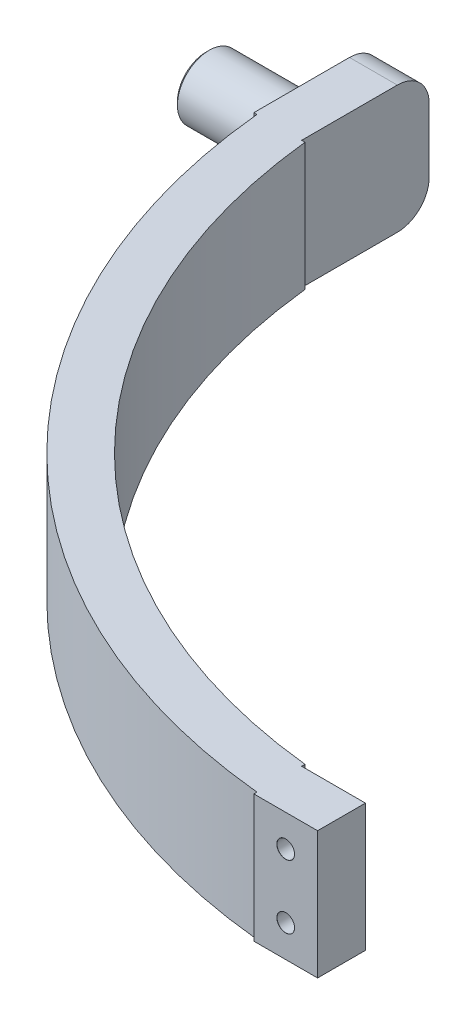
ISO-10303-21;
HEADER;
FILE_DESCRIPTION(('STEP AP214'),'2;1');
FILE_NAME('part.step','',(''),(''),'','','');
FILE_SCHEMA(('AUTOMOTIVE_DESIGN { 1 0 10303 214 1 1 1 1 }'));
ENDSEC;
DATA;
#1=APPLICATION_CONTEXT('core data for automotive mechanical design processes');
#2=APPLICATION_PROTOCOL_DEFINITION('international standard','automotive_design',2000,#1);
#3=PRODUCT_CONTEXT('',#1,'mechanical');
#4=PRODUCT('Part','Part','',(#3));
#5=PRODUCT_RELATED_PRODUCT_CATEGORY('part','',(#4));
#6=PRODUCT_DEFINITION_FORMATION('','',#4);
#7=PRODUCT_DEFINITION_CONTEXT('part definition',#1,'design');
#8=PRODUCT_DEFINITION('design','',#6,#7);
#9=PRODUCT_DEFINITION_SHAPE('','',#8);
#10=(LENGTH_UNIT() NAMED_UNIT(*) SI_UNIT(.MILLI.,.METRE.));
#11=(NAMED_UNIT(*) PLANE_ANGLE_UNIT() SI_UNIT($,.RADIAN.));
#12=(NAMED_UNIT(*) SI_UNIT($,.STERADIAN.) SOLID_ANGLE_UNIT());
#13=UNCERTAINTY_MEASURE_WITH_UNIT(LENGTH_MEASURE(1.E-05),#10,'distance_accuracy_value','');
#14=(GEOMETRIC_REPRESENTATION_CONTEXT(3) GLOBAL_UNCERTAINTY_ASSIGNED_CONTEXT((#13)) GLOBAL_UNIT_ASSIGNED_CONTEXT((#10,
#11,#12)) REPRESENTATION_CONTEXT('',''));
#15=CARTESIAN_POINT('',(0.,0.,0.));
#16=DIRECTION('',(0.,0.,1.));
#17=DIRECTION('',(1.,0.,0.));
#18=AXIS2_PLACEMENT_3D('',#15,#16,#17);
#19=CARTESIAN_POINT('',(0.,40.,0.));
#20=DIRECTION('',(0.,0.,1.));
#21=DIRECTION('',(1.,0.,0.));
#22=AXIS2_PLACEMENT_3D('',#19,#20,#21);
#23=PLANE('',#22);
#24=DIRECTION('',(0.,-1.,0.));
#25=VECTOR('',#24,1.);
#26=CARTESIAN_POINT('',(14.9999999999999,40.,0.));
#27=LINE('',#26,#25);
#28=CARTESIAN_POINT('',(14.9999999999999,30.,0.));
#29=VERTEX_POINT('',#28);
#30=CARTESIAN_POINT('',(14.9999999999999,10.,0.));
#31=VERTEX_POINT('',#30);
#32=EDGE_CURVE('E193',#29,#31,#27,.T.);
#33=ORIENTED_EDGE('',*,*,#32,.T.);
#34=DIRECTION('',(-1.,0.,0.));
#35=VECTOR('',#34,1.);
#36=CARTESIAN_POINT('',(0.,10.,0.));
#37=LINE('',#36,#35);
#38=CARTESIAN_POINT('',(0.,10.,0.));
#39=VERTEX_POINT('',#38);
#40=EDGE_CURVE('E247',#31,#39,#37,.T.);
#41=ORIENTED_EDGE('',*,*,#40,.T.);
#42=DIRECTION('',(0.,-1.,0.));
#43=VECTOR('',#42,1.);
#44=CARTESIAN_POINT('',(0.,40.,0.));
#45=LINE('',#44,#43);
#46=CARTESIAN_POINT('',(0.,30.,0.));
#47=VERTEX_POINT('',#46);
#48=EDGE_CURVE('E166',#47,#39,#45,.T.);
#49=ORIENTED_EDGE('',*,*,#48,.F.);
#50=DIRECTION('',(-1.,0.,0.));
#51=VECTOR('',#50,1.);
#52=CARTESIAN_POINT('',(14.9999999999999,30.,0.));
#53=LINE('',#52,#51);
#54=EDGE_CURVE('E245',#47,#29,#53,.F.);
#55=ORIENTED_EDGE('',*,*,#54,.T.);
#56=EDGE_LOOP('',(#33,#41,#49,#55));
#57=FACE_BOUND('',#56,.T.);
#58=ADVANCED_FACE('F43',(#57),#23,.F.);
#59=CARTESIAN_POINT('',(0.,40.,20.));
#60=DIRECTION('',(1.,0.,0.));
#61=DIRECTION('',(0.,0.,-1.));
#62=AXIS2_PLACEMENT_3D('',#59,#60,#61);
#63=PLANE('',#62);
#64=CARTESIAN_POINT('',(0.,20.,20.));
#65=DIRECTION('',(-1.,0.,0.));
#66=DIRECTION('',(0.,0.,1.));
#67=AXIS2_PLACEMENT_3D('',#64,#65,#66);
#68=CIRCLE('',#67,12.5);
#69=CARTESIAN_POINT('',(0.,20.,32.5));
#70=VERTEX_POINT('',#69);
#71=EDGE_CURVE('E244',#70,#70,#68,.T.);
#72=ORIENTED_EDGE('',*,*,#71,.F.);
#73=EDGE_LOOP('',(#72));
#74=FACE_BOUND('',#73,.T.);
#75=ORIENTED_EDGE('',*,*,#48,.T.);
#76=CARTESIAN_POINT('',(0.,10.,10.));
#77=DIRECTION('',(1.,0.,0.));
#78=DIRECTION('',(0.,0.,-1.));
#79=AXIS2_PLACEMENT_3D('',#76,#77,#78);
#80=CIRCLE('',#79,10.);
#81=CARTESIAN_POINT('',(0.,0.,10.));
#82=VERTEX_POINT('',#81);
#83=EDGE_CURVE('E253',#39,#82,#80,.F.);
#84=ORIENTED_EDGE('',*,*,#83,.T.);
#85=DIRECTION('',(0.,0.,1.));
#86=VECTOR('',#85,1.);
#87=CARTESIAN_POINT('',(0.,0.,20.));
#88=LINE('',#87,#86);
#89=CARTESIAN_POINT('',(0.,0.,40.));
#90=VERTEX_POINT('',#89);
#91=EDGE_CURVE('E163',#82,#90,#88,.T.);
#92=ORIENTED_EDGE('',*,*,#91,.T.);
#93=DIRECTION('',(0.,-1.,0.));
#94=VECTOR('',#93,1.);
#95=CARTESIAN_POINT('',(0.,40.,40.));
#96=LINE('',#95,#94);
#97=CARTESIAN_POINT('',(0.,40.,40.));
#98=VERTEX_POINT('',#97);
#99=EDGE_CURVE('E160',#98,#90,#96,.T.);
#100=ORIENTED_EDGE('',*,*,#99,.F.);
#101=DIRECTION('',(0.,0.,1.));
#102=VECTOR('',#101,1.);
#103=CARTESIAN_POINT('',(0.,40.,0.));
#104=LINE('',#103,#102);
#105=CARTESIAN_POINT('',(0.,40.,10.));
#106=VERTEX_POINT('',#105);
#107=EDGE_CURVE('E148',#106,#98,#104,.T.);
#108=ORIENTED_EDGE('',*,*,#107,.F.);
#109=CARTESIAN_POINT('',(0.,30.,10.));
#110=DIRECTION('',(1.,0.,0.));
#111=DIRECTION('',(0.,0.,-1.));
#112=AXIS2_PLACEMENT_3D('',#109,#110,#111);
#113=CIRCLE('',#112,10.);
#114=EDGE_CURVE('E251',#106,#47,#113,.F.);
#115=ORIENTED_EDGE('',*,*,#114,.T.);
#116=EDGE_LOOP('',(#75,#84,#92,#100,#108,#115));
#117=FACE_BOUND('',#116,.T.);
#118=ADVANCED_FACE('F162',(#74,#117),#63,.F.);
#119=CARTESIAN_POINT('',(0.97794236896835,40.,40.));
#120=DIRECTION('',(0.,0.,-1.));
#121=DIRECTION('',(-1.,0.,0.));
#122=AXIS2_PLACEMENT_3D('',#119,#120,#121);
#123=PLANE('',#122);
#124=DIRECTION('',(1.,0.,0.));
#125=VECTOR('',#124,1.);
#126=CARTESIAN_POINT('',(0.97794236896835,0.,40.));
#127=LINE('',#126,#125);
#128=CARTESIAN_POINT('',(0.97794236896835,0.,40.));
#129=VERTEX_POINT('',#128);
#130=EDGE_CURVE('E195',#90,#129,#127,.T.);
#131=ORIENTED_EDGE('',*,*,#130,.T.);
#132=DIRECTION('',(0.,-1.,0.));
#133=VECTOR('',#132,1.);
#134=CARTESIAN_POINT('',(0.97794236896835,40.,40.));
#135=LINE('',#134,#133);
#136=CARTESIAN_POINT('',(0.97794236896835,40.,40.));
#137=VERTEX_POINT('',#136);
#138=EDGE_CURVE('E167',#137,#129,#135,.T.);
#139=ORIENTED_EDGE('',*,*,#138,.F.);
#140=DIRECTION('',(1.,0.,0.));
#141=VECTOR('',#140,1.);
#142=CARTESIAN_POINT('',(0.97794236896835,40.,40.));
#143=LINE('',#142,#141);
#144=EDGE_CURVE('E152',#98,#137,#143,.T.);
#145=ORIENTED_EDGE('',*,*,#144,.F.);
#146=ORIENTED_EDGE('',*,*,#99,.T.);
#147=EDGE_LOOP('',(#131,#139,#145,#146));
#148=FACE_BOUND('',#147,.T.);
#149=ADVANCED_FACE('F169',(#148),#123,.F.);
#150=CARTESIAN_POINT('',(205.,40.,20.));
#151=DIRECTION('',(0.,-1.,0.));
#152=DIRECTION('',(0.,0.,-1.));
#153=AXIS2_PLACEMENT_3D('',#150,#151,#152);
#154=CYLINDRICAL_SURFACE('',#153,205.);
#155=CARTESIAN_POINT('',(205.,0.,20.));
#156=DIRECTION('',(0.,1.,0.));
#157=DIRECTION('',(0.,0.,-1.));
#158=AXIS2_PLACEMENT_3D('',#155,#156,#157);
#159=CIRCLE('',#158,205.);
#160=CARTESIAN_POINT('',(185.,0.,224.022057631032));
#161=VERTEX_POINT('',#160);
#162=EDGE_CURVE('E198',#129,#161,#159,.T.);
#163=ORIENTED_EDGE('',*,*,#162,.T.);
#164=DIRECTION('',(0.,-1.,0.));
#165=VECTOR('',#164,1.);
#166=CARTESIAN_POINT('',(185.,40.,224.022057631032));
#167=LINE('',#166,#165);
#168=CARTESIAN_POINT('',(185.,40.,224.022057631032));
#169=VERTEX_POINT('',#168);
#170=EDGE_CURVE('E239',#169,#161,#167,.T.);
#171=ORIENTED_EDGE('',*,*,#170,.F.);
#172=CARTESIAN_POINT('',(205.,40.,20.));
#173=DIRECTION('',(0.,1.,0.));
#174=DIRECTION('',(0.,0.,-1.));
#175=AXIS2_PLACEMENT_3D('',#172,#173,#174);
#176=CIRCLE('',#175,205.);
#177=EDGE_CURVE('E172',#137,#169,#176,.T.);
#178=ORIENTED_EDGE('',*,*,#177,.F.);
#179=ORIENTED_EDGE('',*,*,#138,.T.);
#180=EDGE_LOOP('',(#163,#171,#178,#179));
#181=FACE_BOUND('',#180,.T.);
#182=ADVANCED_FACE('F317',(#181),#154,.T.);
#183=CARTESIAN_POINT('',(185.,40.,224.022057631032));
#184=DIRECTION('',(1.,0.,0.));
#185=DIRECTION('',(0.,0.,-1.));
#186=AXIS2_PLACEMENT_3D('',#183,#184,#185);
#187=PLANE('',#186);
#188=DIRECTION('',(0.,0.,1.));
#189=VECTOR('',#188,1.);
#190=CARTESIAN_POINT('',(185.,0.,224.022057631032));
#191=LINE('',#190,#189);
#192=CARTESIAN_POINT('',(185.,0.,225.));
#193=VERTEX_POINT('',#192);
#194=EDGE_CURVE('E200',#161,#193,#191,.T.);
#195=ORIENTED_EDGE('',*,*,#194,.T.);
#196=DIRECTION('',(0.,-1.,0.));
#197=VECTOR('',#196,1.);
#198=CARTESIAN_POINT('',(185.,40.,225.));
#199=LINE('',#198,#197);
#200=CARTESIAN_POINT('',(185.,40.,225.));
#201=VERTEX_POINT('',#200);
#202=EDGE_CURVE('E236',#201,#193,#199,.T.);
#203=ORIENTED_EDGE('',*,*,#202,.F.);
#204=DIRECTION('',(0.,0.,1.));
#205=VECTOR('',#204,1.);
#206=CARTESIAN_POINT('',(185.,40.,224.022057631032));
#207=LINE('',#206,#205);
#208=EDGE_CURVE('E174',#169,#201,#207,.T.);
#209=ORIENTED_EDGE('',*,*,#208,.F.);
#210=ORIENTED_EDGE('',*,*,#170,.T.);
#211=EDGE_LOOP('',(#195,#203,#209,#210));
#212=FACE_BOUND('',#211,.T.);
#213=ADVANCED_FACE('F324',(#212),#187,.F.);
#214=CARTESIAN_POINT('',(205.,40.,225.));
#215=DIRECTION('',(0.,0.,-1.));
#216=DIRECTION('',(-1.,0.,0.));
#217=AXIS2_PLACEMENT_3D('',#214,#215,#216);
#218=PLANE('',#217);
#219=CARTESIAN_POINT('',(195.,30.,225.));
#220=DIRECTION('',(0.,0.,1.));
#221=DIRECTION('',(1.,0.,0.));
#222=AXIS2_PLACEMENT_3D('',#219,#220,#221);
#223=CIRCLE('',#222,2.775);
#224=CARTESIAN_POINT('',(197.775,30.,225.));
#225=VERTEX_POINT('',#224);
#226=EDGE_CURVE('E506',#225,#225,#223,.T.);
#227=ORIENTED_EDGE('',*,*,#226,.F.);
#228=EDGE_LOOP('',(#227));
#229=FACE_BOUND('',#228,.T.);
#230=CARTESIAN_POINT('',(195.,10.,225.));
#231=DIRECTION('',(0.,0.,1.));
#232=DIRECTION('',(1.,0.,0.));
#233=AXIS2_PLACEMENT_3D('',#230,#231,#232);
#234=CIRCLE('',#233,2.775);
#235=CARTESIAN_POINT('',(197.775,10.,225.));
#236=VERTEX_POINT('',#235);
#237=EDGE_CURVE('E266',#236,#236,#234,.T.);
#238=ORIENTED_EDGE('',*,*,#237,.F.);
#239=EDGE_LOOP('',(#238));
#240=FACE_BOUND('',#239,.T.);
#241=DIRECTION('',(1.,0.,0.));
#242=VECTOR('',#241,1.);
#243=CARTESIAN_POINT('',(205.,0.,225.));
#244=LINE('',#243,#242);
#245=CARTESIAN_POINT('',(205.,0.,225.));
#246=VERTEX_POINT('',#245);
#247=EDGE_CURVE('E202',#193,#246,#244,.T.);
#248=ORIENTED_EDGE('',*,*,#247,.T.);
#249=DIRECTION('',(0.,-1.,0.));
#250=VECTOR('',#249,1.);
#251=CARTESIAN_POINT('',(205.,40.,225.));
#252=LINE('',#251,#250);
#253=CARTESIAN_POINT('',(205.,40.,225.));
#254=VERTEX_POINT('',#253);
#255=EDGE_CURVE('E233',#254,#246,#252,.T.);
#256=ORIENTED_EDGE('',*,*,#255,.F.);
#257=DIRECTION('',(1.,0.,0.));
#258=VECTOR('',#257,1.);
#259=CARTESIAN_POINT('',(205.,40.,225.));
#260=LINE('',#259,#258);
#261=EDGE_CURVE('E179',#201,#254,#260,.T.);
#262=ORIENTED_EDGE('',*,*,#261,.F.);
#263=ORIENTED_EDGE('',*,*,#202,.T.);
#264=EDGE_LOOP('',(#248,#256,#262,#263));
#265=FACE_BOUND('',#264,.T.);
#266=ADVANCED_FACE('F327',(#229,#240,#265),#218,.F.);
#267=CARTESIAN_POINT('',(205.,40.,210.));
#268=DIRECTION('',(-1.,0.,0.));
#269=DIRECTION('',(0.,0.,1.));
#270=AXIS2_PLACEMENT_3D('',#267,#268,#269);
#271=PLANE('',#270);
#272=DIRECTION('',(0.,0.,-1.));
#273=VECTOR('',#272,1.);
#274=CARTESIAN_POINT('',(205.,0.,210.));
#275=LINE('',#274,#273);
#276=CARTESIAN_POINT('',(205.,0.,210.));
#277=VERTEX_POINT('',#276);
#278=EDGE_CURVE('E204',#246,#277,#275,.T.);
#279=ORIENTED_EDGE('',*,*,#278,.T.);
#280=DIRECTION('',(0.,-1.,0.));
#281=VECTOR('',#280,1.);
#282=CARTESIAN_POINT('',(205.,40.,210.));
#283=LINE('',#282,#281);
#284=CARTESIAN_POINT('',(205.,40.,210.));
#285=VERTEX_POINT('',#284);
#286=EDGE_CURVE('E230',#285,#277,#283,.T.);
#287=ORIENTED_EDGE('',*,*,#286,.F.);
#288=DIRECTION('',(0.,0.,-1.));
#289=VECTOR('',#288,1.);
#290=CARTESIAN_POINT('',(205.,40.,210.));
#291=LINE('',#290,#289);
#292=EDGE_CURVE('E181',#254,#285,#291,.T.);
#293=ORIENTED_EDGE('',*,*,#292,.F.);
#294=ORIENTED_EDGE('',*,*,#255,.T.);
#295=EDGE_LOOP('',(#279,#287,#293,#294));
#296=FACE_BOUND('',#295,.T.);
#297=ADVANCED_FACE('F332',(#296),#271,.F.);
#298=CARTESIAN_POINT('',(205.,40.,210.));
#299=DIRECTION('',(0.,0.,1.));
#300=DIRECTION('',(1.,0.,0.));
#301=AXIS2_PLACEMENT_3D('',#298,#299,#300);
#302=PLANE('',#301);
#303=CARTESIAN_POINT('',(195.,30.,210.));
#304=DIRECTION('',(0.,0.,1.));
#305=DIRECTION('',(1.,0.,0.));
#306=AXIS2_PLACEMENT_3D('',#303,#304,#305);
#307=CIRCLE('',#306,2.74999999999997);
#308=CARTESIAN_POINT('',(197.75,30.,210.));
#309=VERTEX_POINT('',#308);
#310=EDGE_CURVE('E264',#309,#309,#307,.T.);
#311=ORIENTED_EDGE('',*,*,#310,.T.);
#312=EDGE_LOOP('',(#311));
#313=FACE_BOUND('',#312,.T.);
#314=CARTESIAN_POINT('',(195.,10.,210.));
#315=DIRECTION('',(0.,0.,1.));
#316=DIRECTION('',(1.,0.,0.));
#317=AXIS2_PLACEMENT_3D('',#314,#315,#316);
#318=CIRCLE('',#317,2.74999999999997);
#319=CARTESIAN_POINT('',(197.75,10.,210.));
#320=VERTEX_POINT('',#319);
#321=EDGE_CURVE('E260',#320,#320,#318,.T.);
#322=ORIENTED_EDGE('',*,*,#321,.T.);
#323=EDGE_LOOP('',(#322));
#324=FACE_BOUND('',#323,.T.);
#325=DIRECTION('',(-1.,0.,0.));
#326=VECTOR('',#325,1.);
#327=CARTESIAN_POINT('',(205.,0.,210.));
#328=LINE('',#327,#326);
#329=CARTESIAN_POINT('',(185.,0.,210.));
#330=VERTEX_POINT('',#329);
#331=EDGE_CURVE('E206',#277,#330,#328,.T.);
#332=ORIENTED_EDGE('',*,*,#331,.T.);
#333=DIRECTION('',(0.,-1.,0.));
#334=VECTOR('',#333,1.);
#335=CARTESIAN_POINT('',(185.,40.,210.));
#336=LINE('',#335,#334);
#337=CARTESIAN_POINT('',(185.,40.,210.));
#338=VERTEX_POINT('',#337);
#339=EDGE_CURVE('E227',#338,#330,#336,.T.);
#340=ORIENTED_EDGE('',*,*,#339,.F.);
#341=DIRECTION('',(-1.,0.,0.));
#342=VECTOR('',#341,1.);
#343=CARTESIAN_POINT('',(205.,40.,210.));
#344=LINE('',#343,#342);
#345=EDGE_CURVE('E183',#285,#338,#344,.T.);
#346=ORIENTED_EDGE('',*,*,#345,.F.);
#347=ORIENTED_EDGE('',*,*,#286,.T.);
#348=EDGE_LOOP('',(#332,#340,#346,#347));
#349=FACE_BOUND('',#348,.T.);
#350=ADVANCED_FACE('F338',(#313,#324,#349),#302,.F.);
#351=CARTESIAN_POINT('',(185.,40.,208.944436276912));
#352=DIRECTION('',(-1.,0.,0.));
#353=DIRECTION('',(0.,0.,1.));
#354=AXIS2_PLACEMENT_3D('',#351,#352,#353);
#355=PLANE('',#354);
#356=DIRECTION('',(0.,0.,-1.));
#357=VECTOR('',#356,1.);
#358=CARTESIAN_POINT('',(185.,0.,208.944436276912));
#359=LINE('',#358,#357);
#360=CARTESIAN_POINT('',(185.,0.,208.944436276912));
#361=VERTEX_POINT('',#360);
#362=EDGE_CURVE('E208',#330,#361,#359,.T.);
#363=ORIENTED_EDGE('',*,*,#362,.T.);
#364=DIRECTION('',(0.,-1.,0.));
#365=VECTOR('',#364,1.);
#366=CARTESIAN_POINT('',(185.,40.,208.944436276912));
#367=LINE('',#366,#365);
#368=CARTESIAN_POINT('',(185.,40.,208.944436276912));
#369=VERTEX_POINT('',#368);
#370=EDGE_CURVE('E224',#369,#361,#367,.T.);
#371=ORIENTED_EDGE('',*,*,#370,.F.);
#372=DIRECTION('',(0.,0.,-1.));
#373=VECTOR('',#372,1.);
#374=CARTESIAN_POINT('',(185.,40.,208.944436276912));
#375=LINE('',#374,#373);
#376=EDGE_CURVE('E185',#338,#369,#375,.T.);
#377=ORIENTED_EDGE('',*,*,#376,.F.);
#378=ORIENTED_EDGE('',*,*,#339,.T.);
#379=EDGE_LOOP('',(#363,#371,#377,#378));
#380=FACE_BOUND('',#379,.T.);
#381=ADVANCED_FACE('F342',(#380),#355,.F.);
#382=CARTESIAN_POINT('',(205.,40.,20.));
#383=DIRECTION('',(0.,-1.,0.));
#384=DIRECTION('',(0.,0.,-1.));
#385=AXIS2_PLACEMENT_3D('',#382,#383,#384);
#386=CYLINDRICAL_SURFACE('',#385,190.);
#387=CARTESIAN_POINT('',(205.,0.,20.));
#388=DIRECTION('',(0.,-1.,0.));
#389=DIRECTION('',(0.,0.,1.));
#390=AXIS2_PLACEMENT_3D('',#387,#388,#389);
#391=CIRCLE('',#390,190.);
#392=CARTESIAN_POINT('',(16.0555637230881,0.,39.9999999999999));
#393=VERTEX_POINT('',#392);
#394=EDGE_CURVE('E210',#361,#393,#391,.T.);
#395=ORIENTED_EDGE('',*,*,#394,.T.);
#396=DIRECTION('',(0.,-1.,0.));
#397=VECTOR('',#396,1.);
#398=CARTESIAN_POINT('',(16.0555637230881,40.,39.9999999999999));
#399=LINE('',#398,#397);
#400=CARTESIAN_POINT('',(16.0555637230881,40.,39.9999999999999));
#401=VERTEX_POINT('',#400);
#402=EDGE_CURVE('E221',#401,#393,#399,.T.);
#403=ORIENTED_EDGE('',*,*,#402,.F.);
#404=CARTESIAN_POINT('',(205.,40.,20.));
#405=DIRECTION('',(0.,-1.,0.));
#406=DIRECTION('',(0.,0.,1.));
#407=AXIS2_PLACEMENT_3D('',#404,#405,#406);
#408=CIRCLE('',#407,190.);
#409=EDGE_CURVE('E187',#369,#401,#408,.T.);
#410=ORIENTED_EDGE('',*,*,#409,.F.);
#411=ORIENTED_EDGE('',*,*,#370,.T.);
#412=EDGE_LOOP('',(#395,#403,#410,#411));
#413=FACE_BOUND('',#412,.T.);
#414=ADVANCED_FACE('F347',(#413),#386,.F.);
#415=CARTESIAN_POINT('',(16.0555637230881,40.,40.));
#416=DIRECTION('',(0.,0.,1.));
#417=DIRECTION('',(1.,0.,0.));
#418=AXIS2_PLACEMENT_3D('',#415,#416,#417);
#419=PLANE('',#418);
#420=DIRECTION('',(-1.,0.,0.));
#421=VECTOR('',#420,1.);
#422=CARTESIAN_POINT('',(16.0555637230881,0.,40.));
#423=LINE('',#422,#421);
#424=CARTESIAN_POINT('',(14.9999999999999,0.,40.));
#425=VERTEX_POINT('',#424);
#426=EDGE_CURVE('E212',#393,#425,#423,.T.);
#427=ORIENTED_EDGE('',*,*,#426,.T.);
#428=DIRECTION('',(0.,-1.,0.));
#429=VECTOR('',#428,1.);
#430=CARTESIAN_POINT('',(14.9999999999999,40.,40.));
#431=LINE('',#430,#429);
#432=CARTESIAN_POINT('',(14.9999999999999,40.,40.));
#433=VERTEX_POINT('',#432);
#434=EDGE_CURVE('E218',#433,#425,#431,.T.);
#435=ORIENTED_EDGE('',*,*,#434,.F.);
#436=DIRECTION('',(-1.,0.,0.));
#437=VECTOR('',#436,1.);
#438=CARTESIAN_POINT('',(16.0555637230881,40.,40.));
#439=LINE('',#438,#437);
#440=EDGE_CURVE('E189',#401,#433,#439,.T.);
#441=ORIENTED_EDGE('',*,*,#440,.F.);
#442=ORIENTED_EDGE('',*,*,#402,.T.);
#443=EDGE_LOOP('',(#427,#435,#441,#442));
#444=FACE_BOUND('',#443,.T.);
#445=ADVANCED_FACE('F351',(#444),#419,.F.);
#446=CARTESIAN_POINT('',(14.9999999999999,40.,0.));
#447=DIRECTION('',(-1.,0.,0.));
#448=DIRECTION('',(0.,0.,1.));
#449=AXIS2_PLACEMENT_3D('',#446,#447,#448);
#450=PLANE('',#449);
#451=DIRECTION('',(0.,0.,-1.));
#452=VECTOR('',#451,1.);
#453=CARTESIAN_POINT('',(14.9999999999999,0.,0.));
#454=LINE('',#453,#452);
#455=CARTESIAN_POINT('',(14.9999999999999,0.,10.));
#456=VERTEX_POINT('',#455);
#457=EDGE_CURVE('E157',#425,#456,#454,.T.);
#458=ORIENTED_EDGE('',*,*,#457,.T.);
#459=CARTESIAN_POINT('',(14.9999999999999,10.,10.));
#460=DIRECTION('',(-1.,0.,0.));
#461=DIRECTION('',(0.,0.,1.));
#462=AXIS2_PLACEMENT_3D('',#459,#460,#461);
#463=CIRCLE('',#462,10.);
#464=EDGE_CURVE('E257',#456,#31,#463,.F.);
#465=ORIENTED_EDGE('',*,*,#464,.T.);
#466=ORIENTED_EDGE('',*,*,#32,.F.);
#467=CARTESIAN_POINT('',(14.9999999999999,30.,10.));
#468=DIRECTION('',(-1.,0.,0.));
#469=DIRECTION('',(0.,0.,1.));
#470=AXIS2_PLACEMENT_3D('',#467,#468,#469);
#471=CIRCLE('',#470,10.);
#472=CARTESIAN_POINT('',(14.9999999999999,40.,10.));
#473=VERTEX_POINT('',#472);
#474=EDGE_CURVE('E59',#29,#473,#471,.F.);
#475=ORIENTED_EDGE('',*,*,#474,.T.);
#476=DIRECTION('',(0.,0.,-1.));
#477=VECTOR('',#476,1.);
#478=CARTESIAN_POINT('',(14.9999999999999,40.,20.));
#479=LINE('',#478,#477);
#480=EDGE_CURVE('E191',#433,#473,#479,.T.);
#481=ORIENTED_EDGE('',*,*,#480,.F.);
#482=ORIENTED_EDGE('',*,*,#434,.T.);
#483=EDGE_LOOP('',(#458,#465,#466,#475,#481,#482));
#484=FACE_BOUND('',#483,.T.);
#485=ADVANCED_FACE('F353',(#484),#450,.F.);
#486=CARTESIAN_POINT('',(205.,40.,20.));
#487=DIRECTION('',(0.,1.,0.));
#488=DIRECTION('',(0.,0.,1.));
#489=AXIS2_PLACEMENT_3D('',#486,#487,#488);
#490=PLANE('',#489);
#491=ORIENTED_EDGE('',*,*,#480,.T.);
#492=DIRECTION('',(-1.,0.,0.));
#493=VECTOR('',#492,1.);
#494=CARTESIAN_POINT('',(0.,40.,10.));
#495=LINE('',#494,#493);
#496=EDGE_CURVE('E155',#473,#106,#495,.T.);
#497=ORIENTED_EDGE('',*,*,#496,.T.);
#498=ORIENTED_EDGE('',*,*,#107,.T.);
#499=ORIENTED_EDGE('',*,*,#144,.T.);
#500=ORIENTED_EDGE('',*,*,#177,.T.);
#501=ORIENTED_EDGE('',*,*,#208,.T.);
#502=ORIENTED_EDGE('',*,*,#261,.T.);
#503=ORIENTED_EDGE('',*,*,#292,.T.);
#504=ORIENTED_EDGE('',*,*,#345,.T.);
#505=ORIENTED_EDGE('',*,*,#376,.T.);
#506=ORIENTED_EDGE('',*,*,#409,.T.);
#507=ORIENTED_EDGE('',*,*,#440,.T.);
#508=EDGE_LOOP('',(#491,#497,#498,#499,#500,#501,#502,#503,#504,#505,#506,#507));
#509=FACE_BOUND('',#508,.T.);
#510=ADVANCED_FACE('F150',(#509),#490,.T.);
#511=CARTESIAN_POINT('',(205.,0.,20.));
#512=DIRECTION('',(0.,1.,0.));
#513=DIRECTION('',(0.,0.,1.));
#514=AXIS2_PLACEMENT_3D('',#511,#512,#513);
#515=PLANE('',#514);
#516=ORIENTED_EDGE('',*,*,#91,.F.);
#517=DIRECTION('',(-1.,0.,0.));
#518=VECTOR('',#517,1.);
#519=CARTESIAN_POINT('',(205.,0.,10.));
#520=LINE('',#519,#518);
#521=EDGE_CURVE('E67',#82,#456,#520,.F.);
#522=ORIENTED_EDGE('',*,*,#521,.T.);
#523=ORIENTED_EDGE('',*,*,#457,.F.);
#524=ORIENTED_EDGE('',*,*,#426,.F.);
#525=ORIENTED_EDGE('',*,*,#394,.F.);
#526=ORIENTED_EDGE('',*,*,#362,.F.);
#527=ORIENTED_EDGE('',*,*,#331,.F.);
#528=ORIENTED_EDGE('',*,*,#278,.F.);
#529=ORIENTED_EDGE('',*,*,#247,.F.);
#530=ORIENTED_EDGE('',*,*,#194,.F.);
#531=ORIENTED_EDGE('',*,*,#162,.F.);
#532=ORIENTED_EDGE('',*,*,#130,.F.);
#533=EDGE_LOOP('',(#516,#522,#523,#524,#525,#526,#527,#528,#529,#530,#531,#532));
#534=FACE_BOUND('',#533,.T.);
#535=ADVANCED_FACE('F313',(#534),#515,.F.);
#536=CARTESIAN_POINT('',(-5.00000000000003,20.,20.));
#537=DIRECTION('',(1.,0.,0.));
#538=DIRECTION('',(0.,0.,-1.));
#539=AXIS2_PLACEMENT_3D('',#536,#537,#538);
#540=CYLINDRICAL_SURFACE('',#539,12.5);
#541=CARTESIAN_POINT('',(-5.00000000000003,20.,20.));
#542=DIRECTION('',(-1.,0.,0.));
#543=DIRECTION('',(0.,0.,1.));
#544=AXIS2_PLACEMENT_3D('',#541,#542,#543);
#545=CIRCLE('',#544,12.5);
#546=CARTESIAN_POINT('',(-5.00000000000005,20.,32.5));
#547=VERTEX_POINT('',#546);
#548=EDGE_CURVE('E196',#547,#547,#545,.T.);
#549=ORIENTED_EDGE('',*,*,#548,.F.);
#550=EDGE_LOOP('',(#549));
#551=FACE_BOUND('',#550,.T.);
#552=ORIENTED_EDGE('',*,*,#71,.T.);
#553=EDGE_LOOP('',(#552));
#554=FACE_BOUND('',#553,.T.);
#555=ADVANCED_FACE('F419',(#551,#554),#540,.T.);
#556=CARTESIAN_POINT('',(-5.00000000000003,20.,20.));
#557=DIRECTION('',(-1.,0.,0.));
#558=DIRECTION('',(0.,0.,1.));
#559=AXIS2_PLACEMENT_3D('',#556,#557,#558);
#560=PLANE('',#559);
#561=CARTESIAN_POINT('',(-5.,20.,20.));
#562=DIRECTION('',(-1.,0.,0.));
#563=DIRECTION('',(0.,0.,1.));
#564=AXIS2_PLACEMENT_3D('',#561,#562,#563);
#565=CIRCLE('',#564,9.95);
#566=CARTESIAN_POINT('',(-5.,20.,29.95));
#567=VERTEX_POINT('',#566);
#568=EDGE_CURVE('E248',#567,#567,#565,.T.);
#569=ORIENTED_EDGE('',*,*,#568,.F.);
#570=EDGE_LOOP('',(#569));
#571=FACE_BOUND('',#570,.T.);
#572=ORIENTED_EDGE('',*,*,#548,.T.);
#573=EDGE_LOOP('',(#572));
#574=FACE_BOUND('',#573,.T.);
#575=ADVANCED_FACE('F422',(#571,#574),#560,.T.);
#576=CARTESIAN_POINT('',(-35.,20.,20.));
#577=DIRECTION('',(1.,0.,0.));
#578=DIRECTION('',(0.,0.,-1.));
#579=AXIS2_PLACEMENT_3D('',#576,#577,#578);
#580=CYLINDRICAL_SURFACE('',#579,9.95);
#581=CARTESIAN_POINT('',(-34.,20.,20.));
#582=DIRECTION('',(-1.,0.,0.));
#583=DIRECTION('',(0.,0.,1.));
#584=AXIS2_PLACEMENT_3D('',#581,#582,#583);
#585=CIRCLE('',#584,9.95);
#586=CARTESIAN_POINT('',(-34.,20.,29.95));
#587=VERTEX_POINT('',#586);
#588=EDGE_CURVE('E11',#587,#587,#585,.F.);
#589=ORIENTED_EDGE('',*,*,#588,.T.);
#590=EDGE_LOOP('',(#589));
#591=FACE_BOUND('',#590,.T.);
#592=ORIENTED_EDGE('',*,*,#568,.T.);
#593=EDGE_LOOP('',(#592));
#594=FACE_BOUND('',#593,.T.);
#595=ADVANCED_FACE('F431',(#591,#594),#580,.T.);
#596=CARTESIAN_POINT('',(-35.,20.,20.));
#597=DIRECTION('',(-1.,0.,0.));
#598=DIRECTION('',(0.,0.,1.));
#599=AXIS2_PLACEMENT_3D('',#596,#597,#598);
#600=PLANE('',#599);
#601=CARTESIAN_POINT('',(-35.,20.,20.));
#602=DIRECTION('',(-1.,0.,0.));
#603=DIRECTION('',(0.,0.,1.));
#604=AXIS2_PLACEMENT_3D('',#601,#602,#603);
#605=CIRCLE('',#604,8.94999999999996);
#606=CARTESIAN_POINT('',(-35.,20.,28.95));
#607=VERTEX_POINT('',#606);
#608=EDGE_CURVE('E52',#607,#607,#605,.T.);
#609=ORIENTED_EDGE('',*,*,#608,.T.);
#610=EDGE_LOOP('',(#609));
#611=FACE_BOUND('',#610,.T.);
#612=ADVANCED_FACE('F271',(#611),#600,.T.);
#613=CARTESIAN_POINT('',(0.,10.,10.));
#614=DIRECTION('',(-1.,0.,0.));
#615=DIRECTION('',(0.,0.,1.));
#616=AXIS2_PLACEMENT_3D('',#613,#614,#615);
#617=CYLINDRICAL_SURFACE('',#616,10.);
#618=ORIENTED_EDGE('',*,*,#464,.F.);
#619=ORIENTED_EDGE('',*,*,#521,.F.);
#620=ORIENTED_EDGE('',*,*,#83,.F.);
#621=ORIENTED_EDGE('',*,*,#40,.F.);
#622=EDGE_LOOP('',(#618,#619,#620,#621));
#623=FACE_BOUND('',#622,.T.);
#624=ADVANCED_FACE('F295',(#623),#617,.T.);
#625=CARTESIAN_POINT('',(205.,30.,10.));
#626=DIRECTION('',(1.,0.,0.));
#627=DIRECTION('',(0.,0.,-1.));
#628=AXIS2_PLACEMENT_3D('',#625,#626,#627);
#629=CYLINDRICAL_SURFACE('',#628,10.);
#630=ORIENTED_EDGE('',*,*,#474,.F.);
#631=ORIENTED_EDGE('',*,*,#54,.F.);
#632=ORIENTED_EDGE('',*,*,#114,.F.);
#633=ORIENTED_EDGE('',*,*,#496,.F.);
#634=EDGE_LOOP('',(#630,#631,#632,#633));
#635=FACE_BOUND('',#634,.T.);
#636=ADVANCED_FACE('F297',(#635),#629,.T.);
#637=CARTESIAN_POINT('',(195.,10.,225.));
#638=DIRECTION('',(0.,0.,1.));
#639=DIRECTION('',(1.,0.,0.));
#640=AXIS2_PLACEMENT_3D('',#637,#638,#639);
#641=CYLINDRICAL_SURFACE('',#640,2.74999999999997);
#642=CARTESIAN_POINT('',(195.,10.,224.975));
#643=DIRECTION('',(0.,0.,1.));
#644=DIRECTION('',(1.,0.,0.));
#645=AXIS2_PLACEMENT_3D('',#642,#643,#644);
#646=CIRCLE('',#645,2.75);
#647=CARTESIAN_POINT('',(197.75,10.,224.975));
#648=VERTEX_POINT('',#647);
#649=EDGE_CURVE('E263',#648,#648,#646,.T.);
#650=ORIENTED_EDGE('',*,*,#649,.T.);
#651=EDGE_LOOP('',(#650));
#652=FACE_BOUND('',#651,.T.);
#653=ORIENTED_EDGE('',*,*,#321,.F.);
#654=EDGE_LOOP('',(#653));
#655=FACE_BOUND('',#654,.T.);
#656=ADVANCED_FACE('F300',(#652,#655),#641,.F.);
#657=CARTESIAN_POINT('',(195.,10.,225.));
#658=DIRECTION('',(0.,0.,1.));
#659=DIRECTION('',(1.,0.,0.));
#660=AXIS2_PLACEMENT_3D('',#657,#658,#659);
#661=CONICAL_SURFACE('',#660,2.775,0.785398163397448);
#662=ORIENTED_EDGE('',*,*,#649,.F.);
#663=EDGE_LOOP('',(#662));
#664=FACE_BOUND('',#663,.T.);
#665=ORIENTED_EDGE('',*,*,#237,.T.);
#666=EDGE_LOOP('',(#665));
#667=FACE_BOUND('',#666,.T.);
#668=ADVANCED_FACE('F306',(#664,#667),#661,.F.);
#669=CARTESIAN_POINT('',(195.,30.,225.));
#670=DIRECTION('',(0.,0.,1.));
#671=DIRECTION('',(1.,0.,0.));
#672=AXIS2_PLACEMENT_3D('',#669,#670,#671);
#673=CYLINDRICAL_SURFACE('',#672,2.74999999999997);
#674=CARTESIAN_POINT('',(195.,30.,224.975));
#675=DIRECTION('',(0.,0.,1.));
#676=DIRECTION('',(1.,0.,0.));
#677=AXIS2_PLACEMENT_3D('',#674,#675,#676);
#678=CIRCLE('',#677,2.75);
#679=CARTESIAN_POINT('',(197.75,30.,224.975));
#680=VERTEX_POINT('',#679);
#681=EDGE_CURVE('E267',#680,#680,#678,.T.);
#682=ORIENTED_EDGE('',*,*,#681,.T.);
#683=EDGE_LOOP('',(#682));
#684=FACE_BOUND('',#683,.T.);
#685=ORIENTED_EDGE('',*,*,#310,.F.);
#686=EDGE_LOOP('',(#685));
#687=FACE_BOUND('',#686,.T.);
#688=ADVANCED_FACE('F280',(#684,#687),#673,.F.);
#689=CARTESIAN_POINT('',(195.,30.,225.));
#690=DIRECTION('',(0.,0.,1.));
#691=DIRECTION('',(1.,0.,0.));
#692=AXIS2_PLACEMENT_3D('',#689,#690,#691);
#693=CONICAL_SURFACE('',#692,2.775,0.785398163397448);
#694=ORIENTED_EDGE('',*,*,#681,.F.);
#695=EDGE_LOOP('',(#694));
#696=FACE_BOUND('',#695,.T.);
#697=ORIENTED_EDGE('',*,*,#226,.T.);
#698=EDGE_LOOP('',(#697));
#699=FACE_BOUND('',#698,.T.);
#700=ADVANCED_FACE('F274',(#696,#699),#693,.F.);
#701=CARTESIAN_POINT('',(-35.,20.,20.));
#702=DIRECTION('',(1.,0.,0.));
#703=DIRECTION('',(0.,0.,-1.));
#704=AXIS2_PLACEMENT_3D('',#701,#702,#703);
#705=CONICAL_SURFACE('',#704,8.94999999999996,0.785398163397445);
#706=ORIENTED_EDGE('',*,*,#588,.F.);
#707=EDGE_LOOP('',(#706));
#708=FACE_BOUND('',#707,.T.);
#709=ORIENTED_EDGE('',*,*,#608,.F.);
#710=EDGE_LOOP('',(#709));
#711=FACE_BOUND('',#710,.T.);
#712=ADVANCED_FACE('F46',(#708,#711),#705,.T.);
#713=CLOSED_SHELL('',(#58,#118,#149,#182,#213,#266,#297,#350,#381,#414,#445,#485,#510,#535,#555,
#575,#595,#612,#624,#636,#656,#668,#688,#700,#712));
#714=MANIFOLD_SOLID_BREP('B2',#713);
#715=ADVANCED_BREP_SHAPE_REPRESENTATION('',(#18,#714),#14);
#716=SHAPE_DEFINITION_REPRESENTATION(#9,#715);
ENDSEC;
END-ISO-10303-21;
